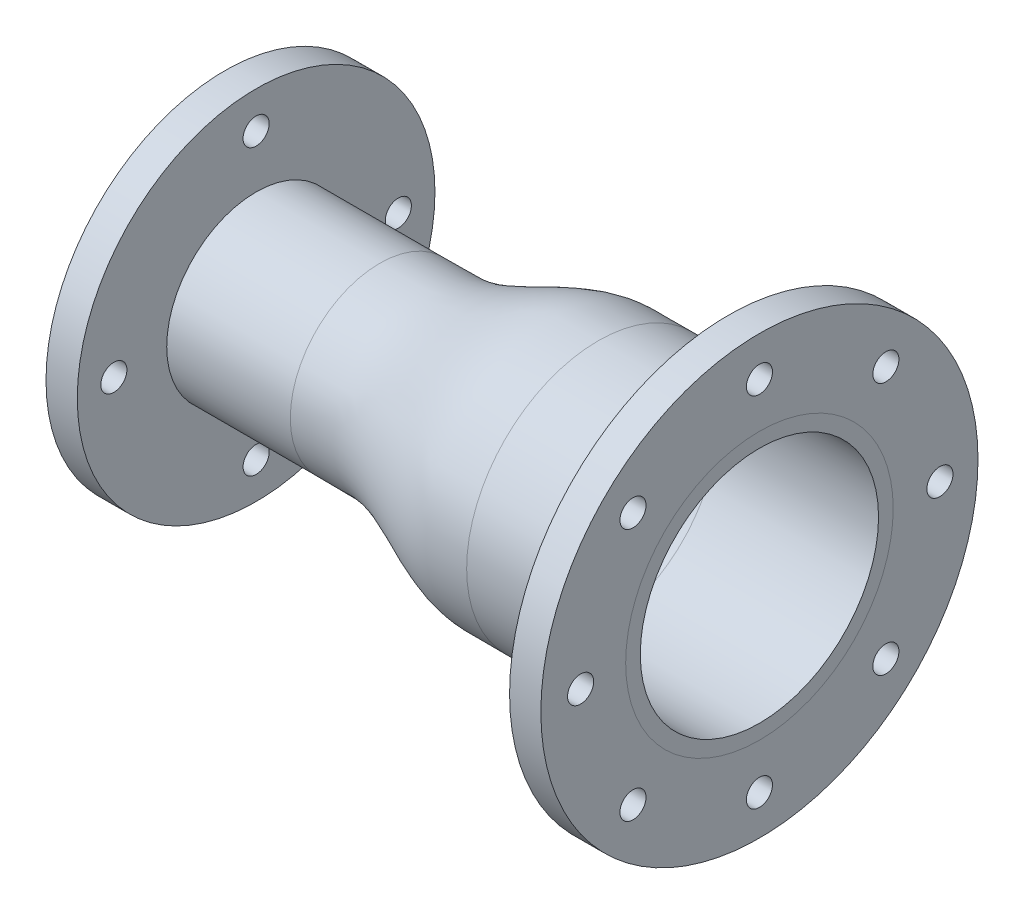
ISO-10303-21;
HEADER;
FILE_DESCRIPTION(('STEP AP214'),'2;1');
FILE_NAME('part.step','',(''),(''),'','','');
FILE_SCHEMA(('AUTOMOTIVE_DESIGN { 1 0 10303 214 1 1 1 1 }'));
ENDSEC;
DATA;
#1=APPLICATION_CONTEXT('core data for automotive mechanical design processes');
#2=APPLICATION_PROTOCOL_DEFINITION('international standard','automotive_design',2000,#1);
#3=PRODUCT_CONTEXT('',#1,'mechanical');
#4=PRODUCT('Part','Part','',(#3));
#5=PRODUCT_RELATED_PRODUCT_CATEGORY('part','',(#4));
#6=PRODUCT_DEFINITION_FORMATION('','',#4);
#7=PRODUCT_DEFINITION_CONTEXT('part definition',#1,'design');
#8=PRODUCT_DEFINITION('design','',#6,#7);
#9=PRODUCT_DEFINITION_SHAPE('','',#8);
#10=(LENGTH_UNIT() NAMED_UNIT(*) SI_UNIT(.MILLI.,.METRE.));
#11=(NAMED_UNIT(*) PLANE_ANGLE_UNIT() SI_UNIT($,.RADIAN.));
#12=(NAMED_UNIT(*) SI_UNIT($,.STERADIAN.) SOLID_ANGLE_UNIT());
#13=UNCERTAINTY_MEASURE_WITH_UNIT(LENGTH_MEASURE(1.E-05),#10,'distance_accuracy_value','');
#14=(GEOMETRIC_REPRESENTATION_CONTEXT(3) GLOBAL_UNCERTAINTY_ASSIGNED_CONTEXT((#13)) GLOBAL_UNIT_ASSIGNED_CONTEXT((#10,
#11,#12)) REPRESENTATION_CONTEXT('',''));
#15=CARTESIAN_POINT('',(0.,0.,0.));
#16=DIRECTION('',(0.,0.,1.));
#17=DIRECTION('',(1.,0.,0.));
#18=AXIS2_PLACEMENT_3D('',#15,#16,#17);
#19=CARTESIAN_POINT('',(341.700000000001,76.1374992115442,0.));
#20=DIRECTION('',(1.,0.,0.));
#21=DIRECTION('',(0.,0.,-1.));
#22=AXIS2_PLACEMENT_3D('',#19,#20,#21);
#23=PLANE('',#22);
#24=CARTESIAN_POINT('',(341.700000000001,114.3,0.));
#25=DIRECTION('',(-1.,0.,0.));
#26=DIRECTION('',(0.,0.,1.));
#27=AXIS2_PLACEMENT_3D('',#24,#25,#26);
#28=CIRCLE('',#27,8.33373999999994);
#29=CARTESIAN_POINT('',(341.700000000001,114.3,8.33373999999994));
#30=VERTEX_POINT('',#29);
#31=EDGE_CURVE('E144',#30,#30,#28,.T.);
#32=ORIENTED_EDGE('',*,*,#31,.T.);
#33=EDGE_LOOP('',(#32));
#34=FACE_BOUND('',#33,.T.);
#35=CARTESIAN_POINT('',(341.700000000001,0.,-115.366574490714));
#36=DIRECTION('',(-1.,0.,0.));
#37=DIRECTION('',(0.,0.,1.));
#38=AXIS2_PLACEMENT_3D('',#35,#36,#37);
#39=CIRCLE('',#38,8.33373999999994);
#40=CARTESIAN_POINT('',(341.700000000001,0.,-107.032834490714));
#41=VERTEX_POINT('',#40);
#42=EDGE_CURVE('E148',#41,#41,#39,.T.);
#43=ORIENTED_EDGE('',*,*,#42,.T.);
#44=EDGE_LOOP('',(#43));
#45=FACE_BOUND('',#44,.T.);
#46=CARTESIAN_POINT('',(341.700000000001,80.822305089622,-80.8223050896228));
#47=DIRECTION('',(-1.,0.,0.));
#48=DIRECTION('',(0.,0.,1.));
#49=AXIS2_PLACEMENT_3D('',#46,#47,#48);
#50=CIRCLE('',#49,8.33373999999994);
#51=CARTESIAN_POINT('',(341.700000000001,80.822305089622,-72.4885650896229));
#52=VERTEX_POINT('',#51);
#53=EDGE_CURVE('E152',#52,#52,#50,.T.);
#54=ORIENTED_EDGE('',*,*,#53,.T.);
#55=EDGE_LOOP('',(#54));
#56=FACE_BOUND('',#55,.T.);
#57=CARTESIAN_POINT('',(341.700000000001,80.8223050896225,80.8223050896222));
#58=DIRECTION('',(-1.,0.,0.));
#59=DIRECTION('',(0.,0.,1.));
#60=AXIS2_PLACEMENT_3D('',#57,#58,#59);
#61=CIRCLE('',#60,8.33373999999994);
#62=CARTESIAN_POINT('',(341.700000000001,80.8223050896225,89.1560450896222));
#63=VERTEX_POINT('',#62);
#64=EDGE_CURVE('E156',#63,#63,#61,.T.);
#65=ORIENTED_EDGE('',*,*,#64,.T.);
#66=EDGE_LOOP('',(#65));
#67=FACE_BOUND('',#66,.T.);
#68=CARTESIAN_POINT('',(341.700000000001,0.,114.3));
#69=DIRECTION('',(-1.,0.,0.));
#70=DIRECTION('',(0.,0.,1.));
#71=AXIS2_PLACEMENT_3D('',#68,#69,#70);
#72=CIRCLE('',#71,8.33373999999994);
#73=CARTESIAN_POINT('',(341.700000000001,0.,122.63374));
#74=VERTEX_POINT('',#73);
#75=EDGE_CURVE('E160',#74,#74,#72,.T.);
#76=ORIENTED_EDGE('',*,*,#75,.T.);
#77=EDGE_LOOP('',(#76));
#78=FACE_BOUND('',#77,.T.);
#79=CARTESIAN_POINT('',(341.700000000001,-80.8223050896222,80.8223050896226));
#80=DIRECTION('',(-1.,0.,0.));
#81=DIRECTION('',(0.,0.,1.));
#82=AXIS2_PLACEMENT_3D('',#79,#80,#81);
#83=CIRCLE('',#82,8.33373999999994);
#84=CARTESIAN_POINT('',(341.700000000001,-80.8223050896222,89.1560450896225));
#85=VERTEX_POINT('',#84);
#86=EDGE_CURVE('E164',#85,#85,#83,.T.);
#87=ORIENTED_EDGE('',*,*,#86,.T.);
#88=EDGE_LOOP('',(#87));
#89=FACE_BOUND('',#88,.T.);
#90=CARTESIAN_POINT('',(341.700000000001,-114.351753494402,0.));
#91=DIRECTION('',(-1.,0.,0.));
#92=DIRECTION('',(0.,0.,1.));
#93=AXIS2_PLACEMENT_3D('',#90,#91,#92);
#94=CIRCLE('',#93,8.33373999999994);
#95=CARTESIAN_POINT('',(341.700000000001,-114.351753494402,8.33373999999994));
#96=VERTEX_POINT('',#95);
#97=EDGE_CURVE('E168',#96,#96,#94,.T.);
#98=ORIENTED_EDGE('',*,*,#97,.T.);
#99=EDGE_LOOP('',(#98));
#100=FACE_BOUND('',#99,.T.);
#101=CARTESIAN_POINT('',(341.700000000001,-80.8223050896231,-80.8223050896217));
#102=DIRECTION('',(-1.,0.,0.));
#103=DIRECTION('',(0.,0.,1.));
#104=AXIS2_PLACEMENT_3D('',#101,#102,#103);
#105=CIRCLE('',#104,8.33373999999994);
#106=CARTESIAN_POINT('',(341.700000000001,-80.8223050896231,-72.4885650896217));
#107=VERTEX_POINT('',#106);
#108=EDGE_CURVE('E172',#107,#107,#105,.T.);
#109=ORIENTED_EDGE('',*,*,#108,.T.);
#110=EDGE_LOOP('',(#109));
#111=FACE_BOUND('',#110,.T.);
#112=CARTESIAN_POINT('',(341.700000000001,0.,0.));
#113=DIRECTION('',(1.,0.,0.));
#114=DIRECTION('',(0.,0.,-1.));
#115=AXIS2_PLACEMENT_3D('',#112,#113,#114);
#116=CIRCLE('',#115,139.7);
#117=CARTESIAN_POINT('',(341.700000000001,0.,-139.7));
#118=VERTEX_POINT('',#117);
#119=EDGE_CURVE('E64',#118,#118,#116,.T.);
#120=ORIENTED_EDGE('',*,*,#119,.T.);
#121=EDGE_LOOP('',(#120));
#122=FACE_BOUND('',#121,.T.);
#123=CARTESIAN_POINT('',(341.700000000001,0.,0.));
#124=DIRECTION('',(1.,0.,0.));
#125=DIRECTION('',(0.,0.,-1.));
#126=AXIS2_PLACEMENT_3D('',#123,#124,#125);
#127=CIRCLE('',#126,85.5);
#128=CARTESIAN_POINT('',(341.700000000001,0.,-85.5));
#129=VERTEX_POINT('',#128);
#130=EDGE_CURVE('E10',#129,#129,#127,.F.);
#131=ORIENTED_EDGE('',*,*,#130,.T.);
#132=EDGE_LOOP('',(#131));
#133=FACE_BOUND('',#132,.T.);
#134=ADVANCED_FACE('F45',(#34,#45,#56,#67,#78,#89,#100,#111,#122,#133),#23,.T.);
#135=CARTESIAN_POINT('',(98.9999999993154,49.1499994635115,0.));
#136=CARTESIAN_POINT('',(102.005905795316,49.1499994635115,0.));
#137=CARTESIAN_POINT('',(106.514717733581,49.1500058205691,0.));
#138=CARTESIAN_POINT('',(111.775161973298,49.1499909865593,0.));
#139=CARTESIAN_POINT('',(114.780889972295,49.1500134485051,0.));
#140=CARTESIAN_POINT('',(117.035873073658,49.1499522232787,0.));
#141=CARTESIAN_POINT('',(118.913072260754,49.1501175034362,0.));
#142=CARTESIAN_POINT('',(120.417271000994,49.1497546651663,0.));
#143=CARTESIAN_POINT('',(121.356980871118,49.1503997728442,0.));
#144=CARTESIAN_POINT('',(122.100741829042,49.1494261179276,0.));
#145=CARTESIAN_POINT('',(122.930150125829,49.1514009467106,0.));
#146=CARTESIAN_POINT('',(124.437765649482,49.1745599052383,0.));
#147=CARTESIAN_POINT('',(127.403841780676,49.3092880479699,0.));
#148=CARTESIAN_POINT('',(131.615917340567,49.7302277733076,0.));
#149=CARTESIAN_POINT('',(136.556364248026,50.5597942292282,0.));
#150=CARTESIAN_POINT('',(141.378908995782,51.6620611481624,0.));
#151=CARTESIAN_POINT('',(147.641323860487,53.4297377742553,0.));
#152=CARTESIAN_POINT('',(155.164556547672,56.0793335742276,0.));
#153=CARTESIAN_POINT('',(163.790302615286,59.6453273603352,0.));
#154=CARTESIAN_POINT('',(172.126179656528,63.3455105597902,0.));
#155=CARTESIAN_POINT('',(180.275439822738,66.9614310497359,0.));
#156=CARTESIAN_POINT('',(188.321466772932,70.2832946888392,0.));
#157=CARTESIAN_POINT('',(194.985358163584,72.6231096372374,0.));
#158=CARTESIAN_POINT('',(200.298712295905,74.1206931091162,0.));
#159=CARTESIAN_POINT('',(204.27061261078,75.0271646674049,0.));
#160=CARTESIAN_POINT('',(208.229301379162,75.6893673997792,0.));
#161=CARTESIAN_POINT('',(211.496695075637,76.0156520568596,0.));
#162=CARTESIAN_POINT('',(213.792519106971,76.1189386638725,0.));
#163=CARTESIAN_POINT('',(215.066881493287,76.1388526472972,0.));
#164=CARTESIAN_POINT('',(216.128457097101,76.1382361001372,0.));
#165=CARTESIAN_POINT('',(217.290602157146,76.1367778298357,0.));
#166=CARTESIAN_POINT('',(218.784669959143,76.1380232475798,0.));
#167=CARTESIAN_POINT('',(220.664664611946,76.1372831486288,0.));
#168=CARTESIAN_POINT('',(222.918904327775,76.1375683266448,0.));
#169=CARTESIAN_POINT('',(225.924981159851,76.1374582812377,0.));
#170=CARTESIAN_POINT('',(231.185175341817,76.1375299775448,0.));
#171=CARTESIAN_POINT('',(235.6940942797,76.1374992113344,0.));
#172=CARTESIAN_POINT('',(238.700000001038,76.1374992115442,0.));
#173=B_SPLINE_CURVE_WITH_KNOTS('',3,(#135,#136,#137,#138,#139,#140,#141,#142,#143,#144,#145,
#146,#147,#148,#149,#150,#151,#152,#153,#154,#155,#156,#157,#158,#159,#160,#161,#162,#163,#164,
#165,#166,#167,#168,#169,#170,#171,#172),.UNSPECIFIED.,.F.,.F.,(4,1,1,1,1,1,1,1,1,1,1,1,1,1,1,1,
1,1,1,1,1,1,1,1,1,1,1,1,1,1,1,1,1,1,1,4),(0.,0.0625,0.09375,0.109375,0.125,0.140625,0.1484375,
0.15625,0.16015625,0.1640625,0.171875,0.1875,0.21875,0.25,0.28125,0.3125,0.375,0.4375,0.5,
0.5625,0.625,0.6875,0.71875,0.75,0.78125,0.8125,0.828125,0.8359375,0.84375,0.8515625,0.859375,
0.875,0.890625,0.90625,0.9375,1.),.UNSPECIFIED.);
#174=CARTESIAN_POINT('',(341.700000000001,0.,0.));
#175=DIRECTION('',(1.,0.,0.));
#176=AXIS1_PLACEMENT('',#174,#175);
#177=SURFACE_OF_REVOLUTION('',#173,#176);
#178=CARTESIAN_POINT('',(238.700000001038,0.,0.));
#179=DIRECTION('',(1.,0.,0.));
#180=DIRECTION('',(0.,0.,-1.));
#181=AXIS2_PLACEMENT_3D('',#178,#179,#180);
#182=CIRCLE('',#181,76.1374992115442);
#183=CARTESIAN_POINT('',(238.700000001038,0.,-76.1374992115442));
#184=VERTEX_POINT('',#183);
#185=EDGE_CURVE('E54',#184,#184,#182,.T.);
#186=ORIENTED_EDGE('',*,*,#185,.T.);
#187=EDGE_LOOP('',(#186));
#188=FACE_BOUND('',#187,.T.);
#189=CARTESIAN_POINT('',(98.9999999993154,0.,0.));
#190=DIRECTION('',(1.,0.,0.));
#191=DIRECTION('',(0.,0.,-1.));
#192=AXIS2_PLACEMENT_3D('',#189,#190,#191);
#193=CIRCLE('',#192,49.1499994635115);
#194=CARTESIAN_POINT('',(98.9999999993154,0.,-49.1499994635115));
#195=VERTEX_POINT('',#194);
#196=EDGE_CURVE('E93',#195,#195,#193,.T.);
#197=ORIENTED_EDGE('',*,*,#196,.F.);
#198=EDGE_LOOP('',(#197));
#199=FACE_BOUND('',#198,.T.);
#200=ADVANCED_FACE('F47',(#188,#199),#177,.F.);
#201=CARTESIAN_POINT('',(341.700000000001,0.,0.));
#202=DIRECTION('',(1.,0.,0.));
#203=DIRECTION('',(0.,0.,-1.));
#204=AXIS2_PLACEMENT_3D('',#201,#202,#203);
#205=CYLINDRICAL_SURFACE('',#204,76.1374992115442);
#206=CARTESIAN_POINT('',(341.700000000001,0.,0.));
#207=DIRECTION('',(1.,0.,0.));
#208=DIRECTION('',(0.,0.,-1.));
#209=AXIS2_PLACEMENT_3D('',#206,#207,#208);
#210=CIRCLE('',#209,76.1374992115442);
#211=CARTESIAN_POINT('',(341.700000000001,0.,-76.1374992115442));
#212=VERTEX_POINT('',#211);
#213=EDGE_CURVE('E60',#212,#212,#210,.T.);
#214=ORIENTED_EDGE('',*,*,#213,.T.);
#215=EDGE_LOOP('',(#214));
#216=FACE_BOUND('',#215,.T.);
#217=ORIENTED_EDGE('',*,*,#185,.F.);
#218=EDGE_LOOP('',(#217));
#219=FACE_BOUND('',#218,.T.);
#220=ADVANCED_FACE('F129',(#216,#219),#205,.F.);
#221=ORIENTED_EDGE('',*,*,#130,.F.);
#222=EDGE_LOOP('',(#221));
#223=FACE_BOUND('',#222,.T.);
#224=ORIENTED_EDGE('',*,*,#213,.F.);
#225=EDGE_LOOP('',(#224));
#226=FACE_BOUND('',#225,.T.);
#227=ADVANCED_FACE('F126',(#223,#226),#23,.T.);
#228=CARTESIAN_POINT('',(341.700000000001,0.,0.));
#229=DIRECTION('',(1.,0.,0.));
#230=DIRECTION('',(0.,0.,-1.));
#231=AXIS2_PLACEMENT_3D('',#228,#229,#230);
#232=CYLINDRICAL_SURFACE('',#231,139.7);
#233=CARTESIAN_POINT('',(321.700000000001,0.,0.));
#234=DIRECTION('',(1.,0.,0.));
#235=DIRECTION('',(0.,0.,-1.));
#236=AXIS2_PLACEMENT_3D('',#233,#234,#235);
#237=CIRCLE('',#236,139.7);
#238=CARTESIAN_POINT('',(321.700000000001,0.,-139.7));
#239=VERTEX_POINT('',#238);
#240=EDGE_CURVE('E69',#239,#239,#237,.T.);
#241=ORIENTED_EDGE('',*,*,#240,.T.);
#242=EDGE_LOOP('',(#241));
#243=FACE_BOUND('',#242,.T.);
#244=ORIENTED_EDGE('',*,*,#119,.F.);
#245=EDGE_LOOP('',(#244));
#246=FACE_BOUND('',#245,.T.);
#247=ADVANCED_FACE('F122',(#243,#246),#232,.T.);
#248=CARTESIAN_POINT('',(321.700000000001,139.7,0.));
#249=DIRECTION('',(-1.,0.,0.));
#250=DIRECTION('',(0.,0.,1.));
#251=AXIS2_PLACEMENT_3D('',#248,#249,#250);
#252=PLANE('',#251);
#253=CARTESIAN_POINT('',(321.700000000001,114.3,0.));
#254=DIRECTION('',(-1.,0.,0.));
#255=DIRECTION('',(0.,0.,1.));
#256=AXIS2_PLACEMENT_3D('',#253,#254,#255);
#257=CIRCLE('',#256,16.1544);
#258=CARTESIAN_POINT('',(321.700000000001,114.3,16.1544));
#259=VERTEX_POINT('',#258);
#260=EDGE_CURVE('E576',#259,#259,#257,.T.);
#261=ORIENTED_EDGE('',*,*,#260,.F.);
#262=EDGE_LOOP('',(#261));
#263=FACE_BOUND('',#262,.T.);
#264=CARTESIAN_POINT('',(321.700000000001,0.,-115.366574490714));
#265=DIRECTION('',(-1.,0.,0.));
#266=DIRECTION('',(0.,0.,1.));
#267=AXIS2_PLACEMENT_3D('',#264,#265,#266);
#268=CIRCLE('',#267,16.1544);
#269=CARTESIAN_POINT('',(321.700000000001,0.,-99.2121744907141));
#270=VERTEX_POINT('',#269);
#271=EDGE_CURVE('E581',#270,#270,#268,.T.);
#272=ORIENTED_EDGE('',*,*,#271,.F.);
#273=EDGE_LOOP('',(#272));
#274=FACE_BOUND('',#273,.T.);
#275=CARTESIAN_POINT('',(321.700000000001,80.822305089622,-80.8223050896228));
#276=DIRECTION('',(-1.,0.,0.));
#277=DIRECTION('',(0.,0.,1.));
#278=AXIS2_PLACEMENT_3D('',#275,#276,#277);
#279=CIRCLE('',#278,16.1544);
#280=CARTESIAN_POINT('',(321.700000000001,80.822305089622,-64.6679050896228));
#281=VERTEX_POINT('',#280);
#282=EDGE_CURVE('E588',#281,#281,#279,.T.);
#283=ORIENTED_EDGE('',*,*,#282,.F.);
#284=EDGE_LOOP('',(#283));
#285=FACE_BOUND('',#284,.T.);
#286=CARTESIAN_POINT('',(321.700000000001,80.8223050896225,80.8223050896222));
#287=DIRECTION('',(-1.,0.,0.));
#288=DIRECTION('',(0.,0.,1.));
#289=AXIS2_PLACEMENT_3D('',#286,#287,#288);
#290=CIRCLE('',#289,16.1544);
#291=CARTESIAN_POINT('',(321.700000000001,80.8223050896225,96.9767050896222));
#292=VERTEX_POINT('',#291);
#293=EDGE_CURVE('E595',#292,#292,#290,.T.);
#294=ORIENTED_EDGE('',*,*,#293,.F.);
#295=EDGE_LOOP('',(#294));
#296=FACE_BOUND('',#295,.T.);
#297=CARTESIAN_POINT('',(321.700000000001,0.,114.3));
#298=DIRECTION('',(-1.,0.,0.));
#299=DIRECTION('',(0.,0.,1.));
#300=AXIS2_PLACEMENT_3D('',#297,#298,#299);
#301=CIRCLE('',#300,16.1544);
#302=CARTESIAN_POINT('',(321.700000000001,0.,130.4544));
#303=VERTEX_POINT('',#302);
#304=EDGE_CURVE('E602',#303,#303,#301,.T.);
#305=ORIENTED_EDGE('',*,*,#304,.F.);
#306=EDGE_LOOP('',(#305));
#307=FACE_BOUND('',#306,.T.);
#308=CARTESIAN_POINT('',(321.700000000001,-80.8223050896222,80.8223050896226));
#309=DIRECTION('',(-1.,0.,0.));
#310=DIRECTION('',(0.,0.,1.));
#311=AXIS2_PLACEMENT_3D('',#308,#309,#310);
#312=CIRCLE('',#311,16.1544);
#313=CARTESIAN_POINT('',(321.700000000001,-80.8223050896222,96.9767050896226));
#314=VERTEX_POINT('',#313);
#315=EDGE_CURVE('E609',#314,#314,#312,.T.);
#316=ORIENTED_EDGE('',*,*,#315,.F.);
#317=EDGE_LOOP('',(#316));
#318=FACE_BOUND('',#317,.T.);
#319=CARTESIAN_POINT('',(321.700000000001,-114.351753494402,0.));
#320=DIRECTION('',(-1.,0.,0.));
#321=DIRECTION('',(0.,0.,1.));
#322=AXIS2_PLACEMENT_3D('',#319,#320,#321);
#323=CIRCLE('',#322,16.1544);
#324=CARTESIAN_POINT('',(321.700000000001,-114.351753494402,16.1544));
#325=VERTEX_POINT('',#324);
#326=EDGE_CURVE('E616',#325,#325,#323,.T.);
#327=ORIENTED_EDGE('',*,*,#326,.F.);
#328=EDGE_LOOP('',(#327));
#329=FACE_BOUND('',#328,.T.);
#330=CARTESIAN_POINT('',(321.700000000001,-80.8223050896231,-80.8223050896217));
#331=DIRECTION('',(-1.,0.,0.));
#332=DIRECTION('',(0.,0.,1.));
#333=AXIS2_PLACEMENT_3D('',#330,#331,#332);
#334=CIRCLE('',#333,16.1544);
#335=CARTESIAN_POINT('',(321.700000000001,-80.8223050896231,-64.6679050896217));
#336=VERTEX_POINT('',#335);
#337=EDGE_CURVE('E183',#336,#336,#334,.T.);
#338=ORIENTED_EDGE('',*,*,#337,.F.);
#339=EDGE_LOOP('',(#338));
#340=FACE_BOUND('',#339,.T.);
#341=CARTESIAN_POINT('',(321.700000000001,0.,0.));
#342=DIRECTION('',(1.,0.,0.));
#343=DIRECTION('',(0.,0.,-1.));
#344=AXIS2_PLACEMENT_3D('',#341,#342,#343);
#345=CIRCLE('',#344,84.1374992115442);
#346=CARTESIAN_POINT('',(321.700000000001,0.,-84.1374992115442));
#347=VERTEX_POINT('',#346);
#348=EDGE_CURVE('E72',#347,#347,#345,.T.);
#349=ORIENTED_EDGE('',*,*,#348,.T.);
#350=EDGE_LOOP('',(#349));
#351=FACE_BOUND('',#350,.T.);
#352=ORIENTED_EDGE('',*,*,#240,.F.);
#353=EDGE_LOOP('',(#352));
#354=FACE_BOUND('',#353,.T.);
#355=ADVANCED_FACE('F118',(#263,#274,#285,#296,#307,#318,#329,#340,#351,#354),#252,.T.);
#356=CARTESIAN_POINT('',(341.700000000001,0.,0.));
#357=DIRECTION('',(1.,0.,0.));
#358=DIRECTION('',(0.,0.,-1.));
#359=AXIS2_PLACEMENT_3D('',#356,#357,#358);
#360=CYLINDRICAL_SURFACE('',#359,84.1374992115442);
#361=CARTESIAN_POINT('',(238.70000000048,0.,0.));
#362=DIRECTION('',(1.,0.,0.));
#363=DIRECTION('',(0.,0.,-1.));
#364=AXIS2_PLACEMENT_3D('',#361,#362,#363);
#365=CIRCLE('',#364,84.1374992115442);
#366=CARTESIAN_POINT('',(238.70000000048,0.,-84.1374992115442));
#367=VERTEX_POINT('',#366);
#368=EDGE_CURVE('E75',#367,#367,#365,.T.);
#369=ORIENTED_EDGE('',*,*,#368,.T.);
#370=EDGE_LOOP('',(#369));
#371=FACE_BOUND('',#370,.T.);
#372=ORIENTED_EDGE('',*,*,#348,.F.);
#373=EDGE_LOOP('',(#372));
#374=FACE_BOUND('',#373,.T.);
#375=ADVANCED_FACE('F113',(#371,#374),#360,.T.);
#376=CARTESIAN_POINT('',(238.70000000048,84.1374992115442,0.));
#377=CARTESIAN_POINT('',(238.355924074551,84.1374992115202,0.));
#378=CARTESIAN_POINT('',(237.667772222693,84.137499211472,0.));
#379=CARTESIAN_POINT('',(236.43892963008,84.1374992118427,0.));
#380=CARTESIAN_POINT('',(234.866011111601,84.1374992093122,0.));
#381=CARTESIAN_POINT('',(233.096477777994,84.1374992210845,0.));
#382=CARTESIAN_POINT('',(231.179483334397,84.1374991812726,0.));
#383=CARTESIAN_POINT('',(229.409949997447,84.1374993464701,0.));
#384=CARTESIAN_POINT('',(227.492955565207,84.1374987853929,0.));
#385=CARTESIAN_POINT('',(225.723422181095,84.13750111552,0.));
#386=CARTESIAN_POINT('',(223.806427909022,84.1374932020653,0.));
#387=CARTESIAN_POINT('',(222.036893859715,84.1375260673476,0.));
#388=CARTESIAN_POINT('',(220.119901846725,84.1374144528191,0.));
#389=CARTESIAN_POINT('',(218.350358415225,84.1378779989106,0.));
#390=CARTESIAN_POINT('',(216.436180481603,84.1363060251998,0.));
#391=CARTESIAN_POINT('',(214.671251810697,84.1428084951467,0.));
#392=CARTESIAN_POINT('',(212.761120780671,84.0867493050435,0.));
#393=CARTESIAN_POINT('',(210.9979704213,83.9818944784432,0.));
#394=CARTESIAN_POINT('',(209.088061418414,83.8116109676752,0.));
#395=CARTESIAN_POINT('',(207.325068084927,83.603702947119,0.));
#396=CARTESIAN_POINT('',(205.415339804882,83.3255776907741,0.));
#397=CARTESIAN_POINT('',(203.652528826209,83.0214768563703,0.));
#398=CARTESIAN_POINT('',(201.742980231223,82.6430546511927,0.));
#399=CARTESIAN_POINT('',(199.980349522116,82.2500814543988,0.));
#400=CARTESIAN_POINT('',(198.070973132176,81.7795890573477,0.));
#401=CARTESIAN_POINT('',(196.308510240827,81.3056366662936,0.));
#402=CARTESIAN_POINT('',(194.399291637108,80.7519213173461,0.));
#403=CARTESIAN_POINT('',(192.636978054456,80.2054342772218,0.));
#404=CARTESIAN_POINT('',(190.727898374793,79.5779232881772,0.));
#405=CARTESIAN_POINT('',(188.965712472328,78.9678586538311,0.));
#406=CARTESIAN_POINT('',(187.056750606921,78.2765114224032,0.));
#407=CARTESIAN_POINT('',(185.294669761322,77.6122903503984,0.));
#408=CARTESIAN_POINT('',(183.385803914716,76.8675406775993,0.));
#409=CARTESIAN_POINT('',(181.623805853851,76.158991089653,0.));
#410=CARTESIAN_POINT('',(179.715014471059,75.3716801136279,0.));
#411=CARTESIAN_POINT('',(177.95307795001,74.6289709788003,0.));
#412=CARTESIAN_POINT('',(176.044340155356,73.8102714548487,0.));
#413=CARTESIAN_POINT('',(174.282445120439,73.0438396560823,0.));
#414=CARTESIAN_POINT('',(172.373740783917,72.2051729542145,0.));
#415=CARTESIAN_POINT('',(170.611868191777,71.4256440883498,0.));
#416=CARTESIAN_POINT('',(168.70177228903,70.5779678092316,0.));
#417=CARTESIAN_POINT('',(166.937395899018,69.7949596588317,0.));
#418=CARTESIAN_POINT('',(165.024786726744,68.9494536465284,0.));
#419=CARTESIAN_POINT('',(163.259291454049,68.17439041256,0.));
#420=CARTESIAN_POINT('',(161.346657228072,67.3438616642089,0.));
#421=CARTESIAN_POINT('',(159.581128610411,66.5879813262985,0.));
#422=CARTESIAN_POINT('',(157.668449277296,65.7840030271469,0.));
#423=CARTESIAN_POINT('',(155.902867536155,65.0578995061593,0.));
#424=CARTESIAN_POINT('',(153.990122342702,64.2918325065566,0.));
#425=CARTESIAN_POINT('',(152.224466539885,63.6058636402684,0.));
#426=CARTESIAN_POINT('',(150.311633973931,62.8887699211763,0.));
#427=CARTESIAN_POINT('',(148.545882007944,62.2529807386855,0.));
#428=CARTESIAN_POINT('',(146.632940071268,61.5955435311837,0.));
#429=CARTESIAN_POINT('',(144.867069113347,61.019596499319,0.));
#430=CARTESIAN_POINT('',(142.953996030364,60.4320486383424,0.));
#431=CARTESIAN_POINT('',(141.187983586384,59.9251619950834,0.));
#432=CARTESIAN_POINT('',(139.274759097703,59.4172235456774,0.));
#433=CARTESIAN_POINT('',(137.508584812843,58.9881184916577,0.));
#434=CARTESIAN_POINT('',(135.595192140913,58.5689442371156,0.));
#435=CARTESIAN_POINT('',(133.828840435065,58.2258008751595,0.));
#436=CARTESIAN_POINT('',(131.915268777067,57.9039386315148,0.));
#437=CARTESIAN_POINT('',(130.148732425359,57.6543573124532,0.));
#438=CARTESIAN_POINT('',(128.234978669205,57.437727634692,0.));
#439=CARTESIAN_POINT('',(126.468267149077,57.2886499220858,0.));
#440=CARTESIAN_POINT('',(124.789582716265,57.1974774560598,0.));
#441=CARTESIAN_POINT('',(123.443760708449,57.1569587361165,0.));
#442=CARTESIAN_POINT('',(122.420535806049,57.1490274176523,0.));
#443=CARTESIAN_POINT('',(121.677966993461,57.1501487521835,0.));
#444=CARTESIAN_POINT('',(120.601758891239,57.1498317942184,0.));
#445=CARTESIAN_POINT('',(119.202172332257,57.1500498808639,0.));
#446=CARTESIAN_POINT('',(117.285177742255,57.149983488862,0.));
#447=CARTESIAN_POINT('',(115.515644451759,57.1500030382082,0.));
#448=CARTESIAN_POINT('',(113.598649996977,57.1499983310186,0.));
#449=CARTESIAN_POINT('',(111.829116666664,57.1499997170491,0.));
#450=CARTESIAN_POINT('',(109.912122221469,57.1499993832964,0.));
#451=CARTESIAN_POINT('',(108.142588888334,57.1499994815527,0.));
#452=CARTESIAN_POINT('',(106.225594443819,57.1499994578749,0.));
#453=CARTESIAN_POINT('',(104.456061110483,57.1499994648313,0.));
#454=CARTESIAN_POINT('',(102.539066666016,57.1499994631282,0.));
#455=CARTESIAN_POINT('',(101.039878703039,57.1499994635708,0.));
#456=CARTESIAN_POINT('',(99.8110361104344,57.1499994635114,0.));
#457=CARTESIAN_POINT('',(99.2703453696884,57.1499994635115,0.));
#458=CARTESIAN_POINT('',(98.9999999993154,57.1499994635115,0.));
#459=(BOUNDED_CURVE() B_SPLINE_CURVE(3,(#376,#377,#378,#379,#380,#381,#382,#383,#384,#385,#386,
#387,#388,#389,#390,#391,#392,#393,#394,#395,#396,#397,#398,#399,#400,#401,#402,#403,#404,#405,
#406,#407,#408,#409,#410,#411,#412,#413,#414,#415,#416,#417,#418,#419,#420,#421,#422,#423,#424,
#425,#426,#427,#428,#429,#430,#431,#432,#433,#434,#435,#436,#437,#438,#439,#440,#441,#442,#443,
#444,#445,#446,#447,#448,#449,#450,#451,#452,#453,#454,#455,#456,#457,#458),.UNSPECIFIED.,.F.,
.F.) B_SPLINE_CURVE_WITH_KNOTS((4,1,1,1,1,1,1,1,1,1,1,1,1,1,1,1,1,1,1,1,1,1,1,1,1,1,1,1,1,1,1,1,
1,1,1,1,1,1,1,1,1,1,1,1,1,1,1,1,1,1,1,1,1,1,1,1,1,1,1,1,1,1,1,1,1,1,1,1,1,1,1,1,1,1,1,1,1,1,1,1,
4),(0.,0.00715416466130086,0.0143083293226017,0.0255505880760745,0.0398589173986762,
0.051101176152149,0.0654095054747508,0.0766517642282235,0.0909600935508253,0.102202352304298,
0.1165106816269,0.127752940380373,0.142061269702974,0.153303528456447,0.167554007786719,
0.178755429228364,0.193030914898765,0.204271904910274,0.218620641734998,0.229935227483346,
0.244395419546109,0.255809504611402,0.270408809056224,0.281939941450494,0.29669540911253,
0.308352906833696,0.323271342218976,0.335056717549753,0.350135378469548,0.362042997576286,
0.3772705556946,0.389288475006168,0.40464616843142,0.416757098654122,0.432220020972812,
0.444402380472081,0.45994086361034,0.472169892049146,0.487750951123586,0.499999861803356,
0.515620649586765,0.527886880088368,0.543480106626163,0.555711059560346,0.571242544952542,
0.583412273814947,0.598850533365244,0.610935794468536,0.626253517756318,0.638234914593141,
0.653410393103734,0.665273470015964,0.680291944874892,0.692028203974552,0.706883095638552,
0.718490902382347,0.733184871620732,0.744670204017162,0.759215980069462,0.770592965802685,
0.785013865191362,0.796305043597434,0.810635097760218,0.821871343483024,0.831256631837378,
0.838627864782687,0.843146284568772,0.846696471543553,0.861004800866154,0.872247059619627,
0.886555388942229,0.897797647695702,0.912105977018304,0.923348235771776,0.937656565094378,
0.948898823847851,0.963207153170453,0.974449411923925,0.988757741246527,0.994378870623264,1.),
.UNSPECIFIED.) CURVE() GEOMETRIC_REPRESENTATION_ITEM() RATIONAL_B_SPLINE_CURVE((0.576132147620015,
0.576132147620015,0.576132147620016,0.576132147620015,0.576132147620016,0.576132147620015,
0.576132147620015,0.576132147620015,0.576132147620015,0.576132147620016,0.576132147620015,
0.576132147620016,0.576132147620015,0.576132147620015,0.576132147620015,0.576132147620015,
0.576132147620016,0.576132147620015,0.576132147620016,0.576132147620016,0.576132147620015,
0.576132147620016,0.576132147620015,0.576132147620016,0.576132147620015,0.576132147620015,
0.576132147620015,0.576132147620015,0.576132147620015,0.576132147620015,0.576132147620016,
0.576132147620015,0.576132147620016,0.576132147620015,0.576132147620016,0.576132147620016,
0.576132147620015,0.576132147620015,0.576132147620015,0.576132147620016,0.576132147620015,
0.576132147620015,0.576132147620016,0.576132147620015,0.576132147620016,0.576132147620015,
0.576132147620015,0.576132147620015,0.576132147620016,0.576132147620015,0.576132147620015,
0.576132147620015,0.576132147620015,0.576132147620016,0.576132147620015,0.576132147620015,
0.576132147620015,0.576132147620015,0.576132147620015,0.576132147620016,0.576132147620015,
0.576132147620016,0.576132147620015,0.576132147620015,0.576132147620015,0.576132147620015,
0.576132147620015,0.576132147620015,0.576132147620015,0.576132147620016,0.576132147620015,
0.576132147620016,0.576132147620015,0.576132147620016,0.576132147620016,0.576132147620016,
0.576132147620015,0.576132147620016,0.576132147620015,0.576132147620016,0.576132147620015,
0.576132147620015,0.576132147620015)) REPRESENTATION_ITEM(''));
#460=CARTESIAN_POINT('',(341.700000000001,0.,0.));
#461=DIRECTION('',(1.,0.,0.));
#462=AXIS1_PLACEMENT('',#460,#461);
#463=SURFACE_OF_REVOLUTION('',#459,#462);
#464=CARTESIAN_POINT('',(98.9999999993154,0.,0.));
#465=DIRECTION('',(1.,0.,0.));
#466=DIRECTION('',(0.,0.,-1.));
#467=AXIS2_PLACEMENT_3D('',#464,#465,#466);
#468=CIRCLE('',#467,57.1499994635115);
#469=CARTESIAN_POINT('',(98.9999999993154,0.,-57.1499994635115));
#470=VERTEX_POINT('',#469);
#471=EDGE_CURVE('E78',#470,#470,#468,.T.);
#472=ORIENTED_EDGE('',*,*,#471,.T.);
#473=EDGE_LOOP('',(#472));
#474=FACE_BOUND('',#473,.T.);
#475=ORIENTED_EDGE('',*,*,#368,.F.);
#476=EDGE_LOOP('',(#475));
#477=FACE_BOUND('',#476,.T.);
#478=ADVANCED_FACE('F108',(#474,#477),#463,.F.);
#479=CARTESIAN_POINT('',(341.700000000001,0.,0.));
#480=DIRECTION('',(1.,0.,0.));
#481=DIRECTION('',(0.,0.,-1.));
#482=AXIS2_PLACEMENT_3D('',#479,#480,#481);
#483=CYLINDRICAL_SURFACE('',#482,57.1499994635115);
#484=CARTESIAN_POINT('',(20.,0.,0.));
#485=DIRECTION('',(1.,0.,0.));
#486=DIRECTION('',(0.,0.,-1.));
#487=AXIS2_PLACEMENT_3D('',#484,#485,#486);
#488=CIRCLE('',#487,57.1499994635115);
#489=CARTESIAN_POINT('',(20.,0.,-57.1499994635115));
#490=VERTEX_POINT('',#489);
#491=EDGE_CURVE('E81',#490,#490,#488,.T.);
#492=ORIENTED_EDGE('',*,*,#491,.T.);
#493=EDGE_LOOP('',(#492));
#494=FACE_BOUND('',#493,.T.);
#495=ORIENTED_EDGE('',*,*,#471,.F.);
#496=EDGE_LOOP('',(#495));
#497=FACE_BOUND('',#496,.T.);
#498=ADVANCED_FACE('F112',(#494,#497),#483,.T.);
#499=CARTESIAN_POINT('',(20.,114.3,0.));
#500=DIRECTION('',(1.,0.,0.));
#501=DIRECTION('',(0.,0.,-1.));
#502=AXIS2_PLACEMENT_3D('',#499,#500,#501);
#503=PLANE('',#502);
#504=CARTESIAN_POINT('',(20.,90.8527596999048,0.));
#505=DIRECTION('',(1.,0.,0.));
#506=DIRECTION('',(0.,0.,-1.));
#507=AXIS2_PLACEMENT_3D('',#504,#505,#506);
#508=CIRCLE('',#507,8.33373999999994);
#509=CARTESIAN_POINT('',(20.,90.8527596999048,-8.33373999999994));
#510=VERTEX_POINT('',#509);
#511=EDGE_CURVE('E180',#510,#510,#508,.F.);
#512=ORIENTED_EDGE('',*,*,#511,.T.);
#513=EDGE_LOOP('',(#512));
#514=FACE_BOUND('',#513,.T.);
#515=CARTESIAN_POINT('',(20.,0.,90.9113801471292));
#516=DIRECTION('',(1.,0.,0.));
#517=DIRECTION('',(0.,0.,-1.));
#518=AXIS2_PLACEMENT_3D('',#515,#516,#517);
#519=CIRCLE('',#518,8.33373999999995);
#520=CARTESIAN_POINT('',(20.,0.,82.5776401471292));
#521=VERTEX_POINT('',#520);
#522=EDGE_CURVE('E192',#521,#521,#519,.F.);
#523=ORIENTED_EDGE('',*,*,#522,.T.);
#524=EDGE_LOOP('',(#523));
#525=FACE_BOUND('',#524,.T.);
#526=CARTESIAN_POINT('',(20.,-90.9113801471292,0.));
#527=DIRECTION('',(1.,0.,0.));
#528=DIRECTION('',(0.,0.,-1.));
#529=AXIS2_PLACEMENT_3D('',#526,#527,#528);
#530=CIRCLE('',#529,8.33373999999994);
#531=CARTESIAN_POINT('',(20.,-90.9113801471292,-8.33373999999994));
#532=VERTEX_POINT('',#531);
#533=EDGE_CURVE('E198',#532,#532,#530,.F.);
#534=ORIENTED_EDGE('',*,*,#533,.T.);
#535=EDGE_LOOP('',(#534));
#536=FACE_BOUND('',#535,.T.);
#537=CARTESIAN_POINT('',(20.,0.,-90.9113801471292));
#538=DIRECTION('',(1.,0.,0.));
#539=DIRECTION('',(0.,0.,-1.));
#540=AXIS2_PLACEMENT_3D('',#537,#538,#539);
#541=CIRCLE('',#540,8.33373999999995);
#542=CARTESIAN_POINT('',(20.,0.,-99.2451201471291));
#543=VERTEX_POINT('',#542);
#544=EDGE_CURVE('E96',#543,#543,#541,.F.);
#545=ORIENTED_EDGE('',*,*,#544,.T.);
#546=EDGE_LOOP('',(#545));
#547=FACE_BOUND('',#546,.T.);
#548=CARTESIAN_POINT('',(20.,0.,0.));
#549=DIRECTION('',(1.,0.,0.));
#550=DIRECTION('',(0.,0.,-1.));
#551=AXIS2_PLACEMENT_3D('',#548,#549,#550);
#552=CIRCLE('',#551,114.3);
#553=CARTESIAN_POINT('',(20.,0.,-114.3));
#554=VERTEX_POINT('',#553);
#555=EDGE_CURVE('E84',#554,#554,#552,.T.);
#556=ORIENTED_EDGE('',*,*,#555,.T.);
#557=EDGE_LOOP('',(#556));
#558=FACE_BOUND('',#557,.T.);
#559=ORIENTED_EDGE('',*,*,#491,.F.);
#560=EDGE_LOOP('',(#559));
#561=FACE_BOUND('',#560,.T.);
#562=ADVANCED_FACE('F206',(#514,#525,#536,#547,#558,#561),#503,.T.);
#563=CARTESIAN_POINT('',(341.700000000001,0.,0.));
#564=DIRECTION('',(1.,0.,0.));
#565=DIRECTION('',(0.,0.,-1.));
#566=AXIS2_PLACEMENT_3D('',#563,#564,#565);
#567=CYLINDRICAL_SURFACE('',#566,114.3);
#568=CARTESIAN_POINT('',(0.,0.,0.));
#569=DIRECTION('',(1.,0.,0.));
#570=DIRECTION('',(0.,0.,-1.));
#571=AXIS2_PLACEMENT_3D('',#568,#569,#570);
#572=CIRCLE('',#571,114.3);
#573=CARTESIAN_POINT('',(0.,0.,-114.3));
#574=VERTEX_POINT('',#573);
#575=EDGE_CURVE('E87',#574,#574,#572,.T.);
#576=ORIENTED_EDGE('',*,*,#575,.T.);
#577=EDGE_LOOP('',(#576));
#578=FACE_BOUND('',#577,.T.);
#579=ORIENTED_EDGE('',*,*,#555,.F.);
#580=EDGE_LOOP('',(#579));
#581=FACE_BOUND('',#580,.T.);
#582=ADVANCED_FACE('F220',(#578,#581),#567,.T.);
#583=CARTESIAN_POINT('',(0.,114.3,0.));
#584=DIRECTION('',(-1.,0.,0.));
#585=DIRECTION('',(0.,0.,1.));
#586=AXIS2_PLACEMENT_3D('',#583,#584,#585);
#587=PLANE('',#586);
#588=CARTESIAN_POINT('',(0.,90.8527596999048,0.));
#589=DIRECTION('',(-1.,0.,0.));
#590=DIRECTION('',(0.,0.,1.));
#591=AXIS2_PLACEMENT_3D('',#588,#589,#590);
#592=CIRCLE('',#591,8.3337399999999);
#593=CARTESIAN_POINT('',(0.,90.8527596999048,8.3337399999999));
#594=VERTEX_POINT('',#593);
#595=EDGE_CURVE('E176',#594,#594,#592,.T.);
#596=ORIENTED_EDGE('',*,*,#595,.F.);
#597=EDGE_LOOP('',(#596));
#598=FACE_BOUND('',#597,.T.);
#599=CARTESIAN_POINT('',(0.,0.,90.9113801471292));
#600=DIRECTION('',(-1.,0.,0.));
#601=DIRECTION('',(0.,0.,1.));
#602=AXIS2_PLACEMENT_3D('',#599,#600,#601);
#603=CIRCLE('',#602,8.3337399999999);
#604=CARTESIAN_POINT('',(0.,0.,99.2451201471291));
#605=VERTEX_POINT('',#604);
#606=EDGE_CURVE('E189',#605,#605,#603,.T.);
#607=ORIENTED_EDGE('',*,*,#606,.F.);
#608=EDGE_LOOP('',(#607));
#609=FACE_BOUND('',#608,.T.);
#610=CARTESIAN_POINT('',(0.,-90.9113801471292,0.));
#611=DIRECTION('',(-1.,0.,0.));
#612=DIRECTION('',(0.,0.,1.));
#613=AXIS2_PLACEMENT_3D('',#610,#611,#612);
#614=CIRCLE('',#613,8.3337399999999);
#615=CARTESIAN_POINT('',(0.,-90.9113801471292,8.3337399999999));
#616=VERTEX_POINT('',#615);
#617=EDGE_CURVE('E195',#616,#616,#614,.T.);
#618=ORIENTED_EDGE('',*,*,#617,.F.);
#619=EDGE_LOOP('',(#618));
#620=FACE_BOUND('',#619,.T.);
#621=CARTESIAN_POINT('',(0.,0.,-90.9113801471292));
#622=DIRECTION('',(-1.,0.,0.));
#623=DIRECTION('',(0.,0.,1.));
#624=AXIS2_PLACEMENT_3D('',#621,#622,#623);
#625=CIRCLE('',#624,8.3337399999999);
#626=CARTESIAN_POINT('',(0.,0.,-82.5776401471293));
#627=VERTEX_POINT('',#626);
#628=EDGE_CURVE('E201',#627,#627,#625,.T.);
#629=ORIENTED_EDGE('',*,*,#628,.F.);
#630=EDGE_LOOP('',(#629));
#631=FACE_BOUND('',#630,.T.);
#632=CARTESIAN_POINT('',(0.,0.,0.));
#633=DIRECTION('',(1.,0.,0.));
#634=DIRECTION('',(0.,0.,-1.));
#635=AXIS2_PLACEMENT_3D('',#632,#633,#634);
#636=CIRCLE('',#635,49.1499994635115);
#637=CARTESIAN_POINT('',(0.,0.,-49.1499994635115));
#638=VERTEX_POINT('',#637);
#639=EDGE_CURVE('E90',#638,#638,#636,.T.);
#640=ORIENTED_EDGE('',*,*,#639,.T.);
#641=EDGE_LOOP('',(#640));
#642=FACE_BOUND('',#641,.T.);
#643=ORIENTED_EDGE('',*,*,#575,.F.);
#644=EDGE_LOOP('',(#643));
#645=FACE_BOUND('',#644,.T.);
#646=ADVANCED_FACE('F217',(#598,#609,#620,#631,#642,#645),#587,.T.);
#647=CARTESIAN_POINT('',(341.700000000001,0.,0.));
#648=DIRECTION('',(1.,0.,0.));
#649=DIRECTION('',(0.,0.,-1.));
#650=AXIS2_PLACEMENT_3D('',#647,#648,#649);
#651=CYLINDRICAL_SURFACE('',#650,49.1499994635115);
#652=ORIENTED_EDGE('',*,*,#196,.T.);
#653=EDGE_LOOP('',(#652));
#654=FACE_BOUND('',#653,.T.);
#655=ORIENTED_EDGE('',*,*,#639,.F.);
#656=EDGE_LOOP('',(#655));
#657=FACE_BOUND('',#656,.T.);
#658=ADVANCED_FACE('F213',(#654,#657),#651,.F.);
#659=CARTESIAN_POINT('',(0.,0.,-90.9113801471292));
#660=DIRECTION('',(-1.,0.,0.));
#661=DIRECTION('',(0.,0.,1.));
#662=AXIS2_PLACEMENT_3D('',#659,#660,#661);
#663=CYLINDRICAL_SURFACE('',#662,8.33373999999995);
#664=ORIENTED_EDGE('',*,*,#544,.F.);
#665=EDGE_LOOP('',(#664));
#666=FACE_BOUND('',#665,.T.);
#667=ORIENTED_EDGE('',*,*,#628,.T.);
#668=EDGE_LOOP('',(#667));
#669=FACE_BOUND('',#668,.T.);
#670=ADVANCED_FACE('F209',(#666,#669),#663,.F.);
#671=CARTESIAN_POINT('',(0.,-90.9113801471292,0.));
#672=DIRECTION('',(-1.,0.,0.));
#673=DIRECTION('',(0.,0.,1.));
#674=AXIS2_PLACEMENT_3D('',#671,#672,#673);
#675=CYLINDRICAL_SURFACE('',#674,8.33373999999994);
#676=ORIENTED_EDGE('',*,*,#533,.F.);
#677=EDGE_LOOP('',(#676));
#678=FACE_BOUND('',#677,.T.);
#679=ORIENTED_EDGE('',*,*,#617,.T.);
#680=EDGE_LOOP('',(#679));
#681=FACE_BOUND('',#680,.T.);
#682=ADVANCED_FACE('F212',(#678,#681),#675,.F.);
#683=CARTESIAN_POINT('',(0.,0.,90.9113801471292));
#684=DIRECTION('',(-1.,0.,0.));
#685=DIRECTION('',(0.,0.,1.));
#686=AXIS2_PLACEMENT_3D('',#683,#684,#685);
#687=CYLINDRICAL_SURFACE('',#686,8.33373999999995);
#688=ORIENTED_EDGE('',*,*,#522,.F.);
#689=EDGE_LOOP('',(#688));
#690=FACE_BOUND('',#689,.T.);
#691=ORIENTED_EDGE('',*,*,#606,.T.);
#692=EDGE_LOOP('',(#691));
#693=FACE_BOUND('',#692,.T.);
#694=ADVANCED_FACE('F275',(#690,#693),#687,.F.);
#695=CARTESIAN_POINT('',(0.,90.8527596999048,0.));
#696=DIRECTION('',(-1.,0.,0.));
#697=DIRECTION('',(0.,0.,1.));
#698=AXIS2_PLACEMENT_3D('',#695,#696,#697);
#699=CYLINDRICAL_SURFACE('',#698,8.33373999999994);
#700=ORIENTED_EDGE('',*,*,#511,.F.);
#701=EDGE_LOOP('',(#700));
#702=FACE_BOUND('',#701,.T.);
#703=ORIENTED_EDGE('',*,*,#595,.T.);
#704=EDGE_LOOP('',(#703));
#705=FACE_BOUND('',#704,.T.);
#706=ADVANCED_FACE('F283',(#702,#705),#699,.F.);
#707=CARTESIAN_POINT('',(321.700000000001,-80.8223050896231,-80.8223050896217));
#708=DIRECTION('',(-1.,0.,0.));
#709=DIRECTION('',(0.,0.,1.));
#710=AXIS2_PLACEMENT_3D('',#707,#708,#709);
#711=CYLINDRICAL_SURFACE('',#710,8.33373999999997);
#712=ORIENTED_EDGE('',*,*,#108,.F.);
#713=EDGE_LOOP('',(#712));
#714=FACE_BOUND('',#713,.T.);
#715=CARTESIAN_POINT('',(328.262312921564,-80.8223050896231,-80.8223050896217));
#716=DIRECTION('',(-1.,0.,0.));
#717=DIRECTION('',(0.,0.,1.));
#718=AXIS2_PLACEMENT_3D('',#715,#716,#717);
#719=CIRCLE('',#718,8.33373999999999);
#720=CARTESIAN_POINT('',(328.262312921564,-80.8223050896231,-72.4885650896217));
#721=VERTEX_POINT('',#720);
#722=EDGE_CURVE('E177',#721,#721,#719,.T.);
#723=ORIENTED_EDGE('',*,*,#722,.T.);
#724=EDGE_LOOP('',(#723));
#725=FACE_BOUND('',#724,.T.);
#726=ADVANCED_FACE('F289',(#714,#725),#711,.F.);
#727=CARTESIAN_POINT('',(321.700000000001,-80.8223050896231,-80.8223050896217));
#728=DIRECTION('',(-1.,0.,0.));
#729=DIRECTION('',(0.,0.,1.));
#730=AXIS2_PLACEMENT_3D('',#727,#728,#729);
#731=CONICAL_SURFACE('',#730,16.1544,0.872664625997166);
#732=ORIENTED_EDGE('',*,*,#722,.F.);
#733=EDGE_LOOP('',(#732));
#734=FACE_BOUND('',#733,.T.);
#735=ORIENTED_EDGE('',*,*,#337,.T.);
#736=EDGE_LOOP('',(#735));
#737=FACE_BOUND('',#736,.T.);
#738=ADVANCED_FACE('F296',(#734,#737),#731,.F.);
#739=CARTESIAN_POINT('',(321.700000000001,-114.351753494402,0.));
#740=DIRECTION('',(-1.,0.,0.));
#741=DIRECTION('',(0.,0.,1.));
#742=AXIS2_PLACEMENT_3D('',#739,#740,#741);
#743=CYLINDRICAL_SURFACE('',#742,8.33373999999997);
#744=ORIENTED_EDGE('',*,*,#97,.F.);
#745=EDGE_LOOP('',(#744));
#746=FACE_BOUND('',#745,.T.);
#747=CARTESIAN_POINT('',(328.262312921564,-114.351753494402,0.));
#748=DIRECTION('',(-1.,0.,0.));
#749=DIRECTION('',(0.,0.,1.));
#750=AXIS2_PLACEMENT_3D('',#747,#748,#749);
#751=CIRCLE('',#750,8.33373999999999);
#752=CARTESIAN_POINT('',(328.262312921564,-114.351753494402,8.33373999999999));
#753=VERTEX_POINT('',#752);
#754=EDGE_CURVE('E619',#753,#753,#751,.T.);
#755=ORIENTED_EDGE('',*,*,#754,.T.);
#756=EDGE_LOOP('',(#755));
#757=FACE_BOUND('',#756,.T.);
#758=ADVANCED_FACE('F303',(#746,#757),#743,.F.);
#759=CARTESIAN_POINT('',(321.700000000001,-114.351753494402,0.));
#760=DIRECTION('',(-1.,0.,0.));
#761=DIRECTION('',(0.,0.,1.));
#762=AXIS2_PLACEMENT_3D('',#759,#760,#761);
#763=CONICAL_SURFACE('',#762,16.1544,0.872664625997166);
#764=ORIENTED_EDGE('',*,*,#754,.F.);
#765=EDGE_LOOP('',(#764));
#766=FACE_BOUND('',#765,.T.);
#767=ORIENTED_EDGE('',*,*,#326,.T.);
#768=EDGE_LOOP('',(#767));
#769=FACE_BOUND('',#768,.T.);
#770=ADVANCED_FACE('F310',(#766,#769),#763,.F.);
#771=CARTESIAN_POINT('',(321.700000000001,-80.8223050896222,80.8223050896226));
#772=DIRECTION('',(-1.,0.,0.));
#773=DIRECTION('',(0.,0.,1.));
#774=AXIS2_PLACEMENT_3D('',#771,#772,#773);
#775=CYLINDRICAL_SURFACE('',#774,8.33373999999997);
#776=ORIENTED_EDGE('',*,*,#86,.F.);
#777=EDGE_LOOP('',(#776));
#778=FACE_BOUND('',#777,.T.);
#779=CARTESIAN_POINT('',(328.262312921564,-80.8223050896222,80.8223050896226));
#780=DIRECTION('',(-1.,0.,0.));
#781=DIRECTION('',(0.,0.,1.));
#782=AXIS2_PLACEMENT_3D('',#779,#780,#781);
#783=CIRCLE('',#782,8.33373999999999);
#784=CARTESIAN_POINT('',(328.262312921564,-80.8223050896222,89.1560450896226));
#785=VERTEX_POINT('',#784);
#786=EDGE_CURVE('E612',#785,#785,#783,.T.);
#787=ORIENTED_EDGE('',*,*,#786,.T.);
#788=EDGE_LOOP('',(#787));
#789=FACE_BOUND('',#788,.T.);
#790=ADVANCED_FACE('F317',(#778,#789),#775,.F.);
#791=CARTESIAN_POINT('',(321.700000000001,-80.8223050896222,80.8223050896226));
#792=DIRECTION('',(-1.,0.,0.));
#793=DIRECTION('',(0.,0.,1.));
#794=AXIS2_PLACEMENT_3D('',#791,#792,#793);
#795=CONICAL_SURFACE('',#794,16.1544,0.872664625997166);
#796=ORIENTED_EDGE('',*,*,#786,.F.);
#797=EDGE_LOOP('',(#796));
#798=FACE_BOUND('',#797,.T.);
#799=ORIENTED_EDGE('',*,*,#315,.T.);
#800=EDGE_LOOP('',(#799));
#801=FACE_BOUND('',#800,.T.);
#802=ADVANCED_FACE('F324',(#798,#801),#795,.F.);
#803=CARTESIAN_POINT('',(321.700000000001,0.,114.3));
#804=DIRECTION('',(-1.,0.,0.));
#805=DIRECTION('',(0.,0.,1.));
#806=AXIS2_PLACEMENT_3D('',#803,#804,#805);
#807=CYLINDRICAL_SURFACE('',#806,8.33373999999996);
#808=ORIENTED_EDGE('',*,*,#75,.F.);
#809=EDGE_LOOP('',(#808));
#810=FACE_BOUND('',#809,.T.);
#811=CARTESIAN_POINT('',(328.262312921564,0.,114.3));
#812=DIRECTION('',(-1.,0.,0.));
#813=DIRECTION('',(0.,0.,1.));
#814=AXIS2_PLACEMENT_3D('',#811,#812,#813);
#815=CIRCLE('',#814,8.33373999999999);
#816=CARTESIAN_POINT('',(328.262312921564,0.,122.63374));
#817=VERTEX_POINT('',#816);
#818=EDGE_CURVE('E605',#817,#817,#815,.T.);
#819=ORIENTED_EDGE('',*,*,#818,.T.);
#820=EDGE_LOOP('',(#819));
#821=FACE_BOUND('',#820,.T.);
#822=ADVANCED_FACE('F331',(#810,#821),#807,.F.);
#823=CARTESIAN_POINT('',(321.700000000001,0.,114.3));
#824=DIRECTION('',(-1.,0.,0.));
#825=DIRECTION('',(0.,0.,1.));
#826=AXIS2_PLACEMENT_3D('',#823,#824,#825);
#827=CONICAL_SURFACE('',#826,16.1544,0.872664625997166);
#828=ORIENTED_EDGE('',*,*,#818,.F.);
#829=EDGE_LOOP('',(#828));
#830=FACE_BOUND('',#829,.T.);
#831=ORIENTED_EDGE('',*,*,#304,.T.);
#832=EDGE_LOOP('',(#831));
#833=FACE_BOUND('',#832,.T.);
#834=ADVANCED_FACE('F338',(#830,#833),#827,.F.);
#835=CARTESIAN_POINT('',(321.700000000001,80.8223050896225,80.8223050896222));
#836=DIRECTION('',(-1.,0.,0.));
#837=DIRECTION('',(0.,0.,1.));
#838=AXIS2_PLACEMENT_3D('',#835,#836,#837);
#839=CYLINDRICAL_SURFACE('',#838,8.33373999999997);
#840=ORIENTED_EDGE('',*,*,#64,.F.);
#841=EDGE_LOOP('',(#840));
#842=FACE_BOUND('',#841,.T.);
#843=CARTESIAN_POINT('',(328.262312921564,80.8223050896225,80.8223050896222));
#844=DIRECTION('',(-1.,0.,0.));
#845=DIRECTION('',(0.,0.,1.));
#846=AXIS2_PLACEMENT_3D('',#843,#844,#845);
#847=CIRCLE('',#846,8.33373999999999);
#848=CARTESIAN_POINT('',(328.262312921564,80.8223050896225,89.1560450896222));
#849=VERTEX_POINT('',#848);
#850=EDGE_CURVE('E598',#849,#849,#847,.T.);
#851=ORIENTED_EDGE('',*,*,#850,.T.);
#852=EDGE_LOOP('',(#851));
#853=FACE_BOUND('',#852,.T.);
#854=ADVANCED_FACE('F345',(#842,#853),#839,.F.);
#855=CARTESIAN_POINT('',(321.700000000001,80.8223050896225,80.8223050896222));
#856=DIRECTION('',(-1.,0.,0.));
#857=DIRECTION('',(0.,0.,1.));
#858=AXIS2_PLACEMENT_3D('',#855,#856,#857);
#859=CONICAL_SURFACE('',#858,16.1544,0.872664625997166);
#860=ORIENTED_EDGE('',*,*,#850,.F.);
#861=EDGE_LOOP('',(#860));
#862=FACE_BOUND('',#861,.T.);
#863=ORIENTED_EDGE('',*,*,#293,.T.);
#864=EDGE_LOOP('',(#863));
#865=FACE_BOUND('',#864,.T.);
#866=ADVANCED_FACE('F352',(#862,#865),#859,.F.);
#867=CARTESIAN_POINT('',(321.700000000001,80.822305089622,-80.8223050896228));
#868=DIRECTION('',(-1.,0.,0.));
#869=DIRECTION('',(0.,0.,1.));
#870=AXIS2_PLACEMENT_3D('',#867,#868,#869);
#871=CYLINDRICAL_SURFACE('',#870,8.33373999999997);
#872=ORIENTED_EDGE('',*,*,#53,.F.);
#873=EDGE_LOOP('',(#872));
#874=FACE_BOUND('',#873,.T.);
#875=CARTESIAN_POINT('',(328.262312921564,80.822305089622,-80.8223050896228));
#876=DIRECTION('',(-1.,0.,0.));
#877=DIRECTION('',(0.,0.,1.));
#878=AXIS2_PLACEMENT_3D('',#875,#876,#877);
#879=CIRCLE('',#878,8.33373999999999);
#880=CARTESIAN_POINT('',(328.262312921564,80.822305089622,-72.4885650896228));
#881=VERTEX_POINT('',#880);
#882=EDGE_CURVE('E591',#881,#881,#879,.T.);
#883=ORIENTED_EDGE('',*,*,#882,.T.);
#884=EDGE_LOOP('',(#883));
#885=FACE_BOUND('',#884,.T.);
#886=ADVANCED_FACE('F359',(#874,#885),#871,.F.);
#887=CARTESIAN_POINT('',(321.700000000001,80.822305089622,-80.8223050896228));
#888=DIRECTION('',(-1.,0.,0.));
#889=DIRECTION('',(0.,0.,1.));
#890=AXIS2_PLACEMENT_3D('',#887,#888,#889);
#891=CONICAL_SURFACE('',#890,16.1544,0.872664625997166);
#892=ORIENTED_EDGE('',*,*,#882,.F.);
#893=EDGE_LOOP('',(#892));
#894=FACE_BOUND('',#893,.T.);
#895=ORIENTED_EDGE('',*,*,#282,.T.);
#896=EDGE_LOOP('',(#895));
#897=FACE_BOUND('',#896,.T.);
#898=ADVANCED_FACE('F366',(#894,#897),#891,.F.);
#899=CARTESIAN_POINT('',(321.700000000001,0.,-115.366574490714));
#900=DIRECTION('',(-1.,0.,0.));
#901=DIRECTION('',(0.,0.,1.));
#902=AXIS2_PLACEMENT_3D('',#899,#900,#901);
#903=CYLINDRICAL_SURFACE('',#902,8.33373999999996);
#904=ORIENTED_EDGE('',*,*,#42,.F.);
#905=EDGE_LOOP('',(#904));
#906=FACE_BOUND('',#905,.T.);
#907=CARTESIAN_POINT('',(328.262312921564,0.,-115.366574490714));
#908=DIRECTION('',(-1.,0.,0.));
#909=DIRECTION('',(0.,0.,1.));
#910=AXIS2_PLACEMENT_3D('',#907,#908,#909);
#911=CIRCLE('',#910,8.33373999999999);
#912=CARTESIAN_POINT('',(328.262312921564,0.,-107.032834490714));
#913=VERTEX_POINT('',#912);
#914=EDGE_CURVE('E584',#913,#913,#911,.T.);
#915=ORIENTED_EDGE('',*,*,#914,.T.);
#916=EDGE_LOOP('',(#915));
#917=FACE_BOUND('',#916,.T.);
#918=ADVANCED_FACE('F372',(#906,#917),#903,.F.);
#919=CARTESIAN_POINT('',(321.700000000001,0.,-115.366574490714));
#920=DIRECTION('',(-1.,0.,0.));
#921=DIRECTION('',(0.,0.,1.));
#922=AXIS2_PLACEMENT_3D('',#919,#920,#921);
#923=CONICAL_SURFACE('',#922,16.1544,0.872664625997166);
#924=ORIENTED_EDGE('',*,*,#914,.F.);
#925=EDGE_LOOP('',(#924));
#926=FACE_BOUND('',#925,.T.);
#927=ORIENTED_EDGE('',*,*,#271,.T.);
#928=EDGE_LOOP('',(#927));
#929=FACE_BOUND('',#928,.T.);
#930=ADVANCED_FACE('F379',(#926,#929),#923,.F.);
#931=CARTESIAN_POINT('',(321.700000000001,114.3,0.));
#932=DIRECTION('',(-1.,0.,0.));
#933=DIRECTION('',(0.,0.,1.));
#934=AXIS2_PLACEMENT_3D('',#931,#932,#933);
#935=CYLINDRICAL_SURFACE('',#934,8.33373999999997);
#936=ORIENTED_EDGE('',*,*,#31,.F.);
#937=EDGE_LOOP('',(#936));
#938=FACE_BOUND('',#937,.T.);
#939=CARTESIAN_POINT('',(328.262312921564,114.3,0.));
#940=DIRECTION('',(-1.,0.,0.));
#941=DIRECTION('',(0.,0.,1.));
#942=AXIS2_PLACEMENT_3D('',#939,#940,#941);
#943=CIRCLE('',#942,8.33373999999999);
#944=CARTESIAN_POINT('',(328.262312921564,114.3,8.33373999999999));
#945=VERTEX_POINT('',#944);
#946=EDGE_CURVE('E573',#945,#945,#943,.T.);
#947=ORIENTED_EDGE('',*,*,#946,.T.);
#948=EDGE_LOOP('',(#947));
#949=FACE_BOUND('',#948,.T.);
#950=ADVANCED_FACE('F385',(#938,#949),#935,.F.);
#951=CARTESIAN_POINT('',(321.700000000001,114.3,0.));
#952=DIRECTION('',(-1.,0.,0.));
#953=DIRECTION('',(0.,0.,1.));
#954=AXIS2_PLACEMENT_3D('',#951,#952,#953);
#955=CONICAL_SURFACE('',#954,16.1544,0.872664625997167);
#956=ORIENTED_EDGE('',*,*,#946,.F.);
#957=EDGE_LOOP('',(#956));
#958=FACE_BOUND('',#957,.T.);
#959=ORIENTED_EDGE('',*,*,#260,.T.);
#960=EDGE_LOOP('',(#959));
#961=FACE_BOUND('',#960,.T.);
#962=ADVANCED_FACE('F392',(#958,#961),#955,.F.);
#963=CLOSED_SHELL('',(#134,#200,#220,#227,#247,#355,#375,#478,#498,#562,#582,#646,#658,#670,
#682,#694,#706,#726,#738,#758,#770,#790,#802,#822,#834,#854,#866,#886,#898,#918,#930,#950,#962));
#964=MANIFOLD_SOLID_BREP('B2',#963);
#965=ADVANCED_BREP_SHAPE_REPRESENTATION('',(#18,#964),#14);
#966=SHAPE_DEFINITION_REPRESENTATION(#9,#965);
ENDSEC;
END-ISO-10303-21;
